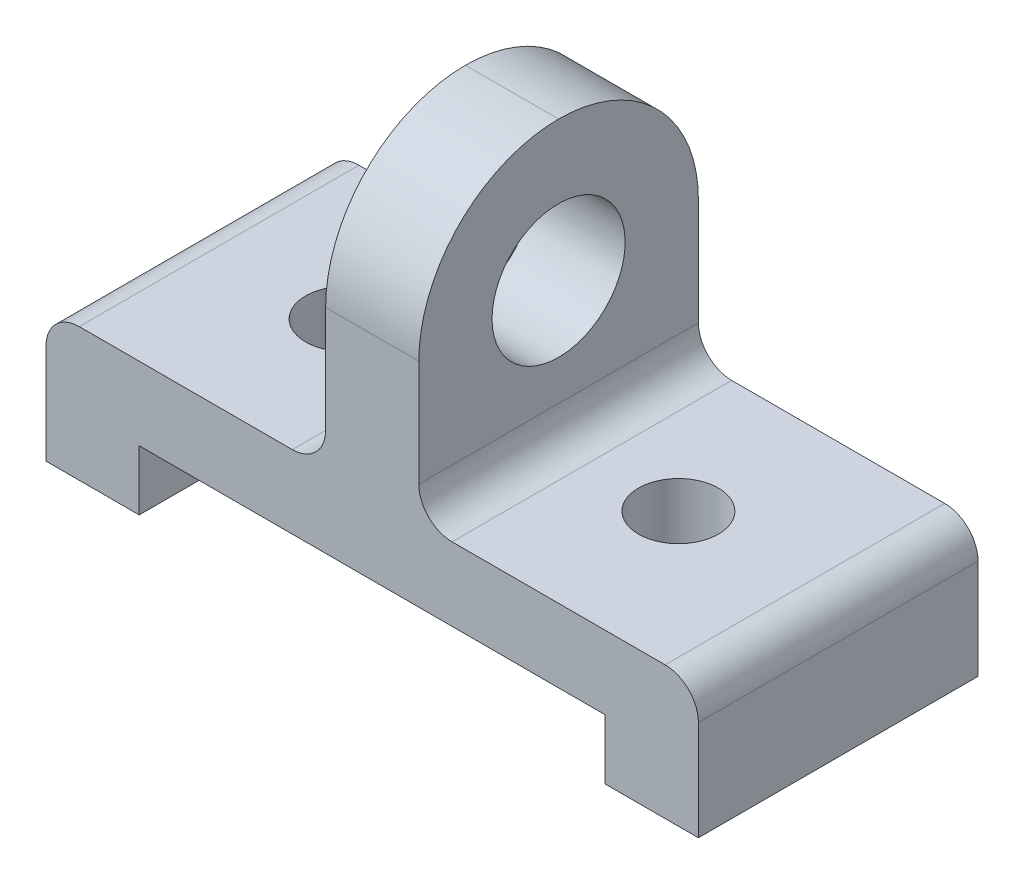
ISO-10303-21;
HEADER;
FILE_DESCRIPTION(('STEP AP214'),'2;1');
FILE_NAME('part.step','',(''),(''),'','','');
FILE_SCHEMA(('AUTOMOTIVE_DESIGN { 1 0 10303 214 1 1 1 1 }'));
ENDSEC;
DATA;
#1=APPLICATION_CONTEXT('core data for automotive mechanical design processes');
#2=APPLICATION_PROTOCOL_DEFINITION('international standard','automotive_design',2000,#1);
#3=PRODUCT_CONTEXT('',#1,'mechanical');
#4=PRODUCT('Part','Part','',(#3));
#5=PRODUCT_RELATED_PRODUCT_CATEGORY('part','',(#4));
#6=PRODUCT_DEFINITION_FORMATION('','',#4);
#7=PRODUCT_DEFINITION_CONTEXT('part definition',#1,'design');
#8=PRODUCT_DEFINITION('design','',#6,#7);
#9=PRODUCT_DEFINITION_SHAPE('','',#8);
#10=(LENGTH_UNIT() NAMED_UNIT(*) SI_UNIT(.MILLI.,.METRE.));
#11=(NAMED_UNIT(*) PLANE_ANGLE_UNIT() SI_UNIT($,.RADIAN.));
#12=(NAMED_UNIT(*) SI_UNIT($,.STERADIAN.) SOLID_ANGLE_UNIT());
#13=UNCERTAINTY_MEASURE_WITH_UNIT(LENGTH_MEASURE(1.E-05),#10,'distance_accuracy_value','');
#14=(GEOMETRIC_REPRESENTATION_CONTEXT(3) GLOBAL_UNCERTAINTY_ASSIGNED_CONTEXT((#13)) GLOBAL_UNIT_ASSIGNED_CONTEXT((#10,
#11,#12)) REPRESENTATION_CONTEXT('',''));
#15=CARTESIAN_POINT('',(0.,0.,0.));
#16=DIRECTION('',(0.,0.,1.));
#17=DIRECTION('',(1.,0.,0.));
#18=AXIS2_PLACEMENT_3D('',#15,#16,#17);
#19=CARTESIAN_POINT('',(0.,11.,0.));
#20=DIRECTION('',(0.,1.,0.));
#21=DIRECTION('',(0.,0.,1.));
#22=AXIS2_PLACEMENT_3D('',#19,#20,#21);
#23=PLANE('',#22);
#24=CARTESIAN_POINT('',(25.,11.,0.));
#25=DIRECTION('',(0.,1.,0.));
#26=DIRECTION('',(0.,0.,1.));
#27=AXIS2_PLACEMENT_3D('',#24,#25,#26);
#28=CIRCLE('',#27,6.);
#29=CARTESIAN_POINT('',(25.,11.,6.));
#30=VERTEX_POINT('',#29);
#31=EDGE_CURVE('E194',#30,#30,#28,.T.);
#32=ORIENTED_EDGE('',*,*,#31,.F.);
#33=EDGE_LOOP('',(#32));
#34=FACE_BOUND('',#33,.T.);
#35=DIRECTION('',(-1.,0.,0.));
#36=VECTOR('',#35,1.);
#37=CARTESIAN_POINT('',(-49.,11.,-21.));
#38=LINE('',#37,#36);
#39=CARTESIAN_POINT('',(44.,11.,-21.));
#40=VERTEX_POINT('',#39);
#41=CARTESIAN_POINT('',(12.,11.,-21.));
#42=VERTEX_POINT('',#41);
#43=EDGE_CURVE('E237',#40,#42,#38,.T.);
#44=ORIENTED_EDGE('',*,*,#43,.T.);
#45=DIRECTION('',(0.,0.,1.));
#46=VECTOR('',#45,1.);
#47=CARTESIAN_POINT('',(12.,11.,0.));
#48=LINE('',#47,#46);
#49=CARTESIAN_POINT('',(12.,11.,21.));
#50=VERTEX_POINT('',#49);
#51=EDGE_CURVE('E326',#42,#50,#48,.T.);
#52=ORIENTED_EDGE('',*,*,#51,.T.);
#53=DIRECTION('',(1.,0.,0.));
#54=VECTOR('',#53,1.);
#55=CARTESIAN_POINT('',(-49.,11.,21.));
#56=LINE('',#55,#54);
#57=CARTESIAN_POINT('',(44.,11.,21.));
#58=VERTEX_POINT('',#57);
#59=EDGE_CURVE('E241',#50,#58,#56,.T.);
#60=ORIENTED_EDGE('',*,*,#59,.T.);
#61=DIRECTION('',(0.,0.,-1.));
#62=VECTOR('',#61,1.);
#63=CARTESIAN_POINT('',(44.,11.,-21.));
#64=LINE('',#63,#62);
#65=EDGE_CURVE('E263',#58,#40,#64,.T.);
#66=ORIENTED_EDGE('',*,*,#65,.T.);
#67=EDGE_LOOP('',(#44,#52,#60,#66));
#68=FACE_BOUND('',#67,.T.);
#69=ADVANCED_FACE('F39',(#34,#68),#23,.T.);
#70=CARTESIAN_POINT('',(-25.,11.,0.));
#71=DIRECTION('',(0.,1.,0.));
#72=DIRECTION('',(0.,0.,1.));
#73=AXIS2_PLACEMENT_3D('',#70,#71,#72);
#74=CIRCLE('',#73,6.);
#75=CARTESIAN_POINT('',(-25.,11.,6.));
#76=VERTEX_POINT('',#75);
#77=EDGE_CURVE('E291',#76,#76,#74,.T.);
#78=ORIENTED_EDGE('',*,*,#77,.F.);
#79=EDGE_LOOP('',(#78));
#80=FACE_BOUND('',#79,.T.);
#81=CARTESIAN_POINT('',(-44.,11.,21.));
#82=VERTEX_POINT('',#81);
#83=CARTESIAN_POINT('',(-12.,11.,21.));
#84=VERTEX_POINT('',#83);
#85=EDGE_CURVE('E243',#82,#84,#56,.T.);
#86=ORIENTED_EDGE('',*,*,#85,.T.);
#87=DIRECTION('',(0.,0.,-1.));
#88=VECTOR('',#87,1.);
#89=CARTESIAN_POINT('',(-12.,11.,0.));
#90=LINE('',#89,#88);
#91=CARTESIAN_POINT('',(-12.,11.,-21.));
#92=VERTEX_POINT('',#91);
#93=EDGE_CURVE('E313',#84,#92,#90,.T.);
#94=ORIENTED_EDGE('',*,*,#93,.T.);
#95=CARTESIAN_POINT('',(-44.,11.,-21.));
#96=VERTEX_POINT('',#95);
#97=EDGE_CURVE('E242',#92,#96,#38,.T.);
#98=ORIENTED_EDGE('',*,*,#97,.T.);
#99=DIRECTION('',(0.,0.,1.));
#100=VECTOR('',#99,1.);
#101=CARTESIAN_POINT('',(-44.,11.,21.));
#102=LINE('',#101,#100);
#103=EDGE_CURVE('E259',#96,#82,#102,.T.);
#104=ORIENTED_EDGE('',*,*,#103,.T.);
#105=EDGE_LOOP('',(#86,#94,#98,#104));
#106=FACE_BOUND('',#105,.T.);
#107=ADVANCED_FACE('F343',(#80,#106),#23,.T.);
#108=CARTESIAN_POINT('',(49.,11.,-21.));
#109=DIRECTION('',(-1.,0.,0.));
#110=DIRECTION('',(0.,0.,1.));
#111=AXIS2_PLACEMENT_3D('',#108,#109,#110);
#112=PLANE('',#111);
#113=DIRECTION('',(0.,-1.,0.));
#114=VECTOR('',#113,1.);
#115=CARTESIAN_POINT('',(49.,11.,-21.));
#116=LINE('',#115,#114);
#117=CARTESIAN_POINT('',(49.,6.,-21.));
#118=VERTEX_POINT('',#117);
#119=CARTESIAN_POINT('',(49.,-9.,-21.));
#120=VERTEX_POINT('',#119);
#121=EDGE_CURVE('E256',#118,#120,#116,.T.);
#122=ORIENTED_EDGE('',*,*,#121,.F.);
#123=DIRECTION('',(0.,0.,-1.));
#124=VECTOR('',#123,1.);
#125=CARTESIAN_POINT('',(49.,6.,21.));
#126=LINE('',#125,#124);
#127=CARTESIAN_POINT('',(49.,6.,21.));
#128=VERTEX_POINT('',#127);
#129=EDGE_CURVE('E274',#118,#128,#126,.F.);
#130=ORIENTED_EDGE('',*,*,#129,.T.);
#131=DIRECTION('',(0.,-1.,0.));
#132=VECTOR('',#131,1.);
#133=CARTESIAN_POINT('',(49.,11.,21.));
#134=LINE('',#133,#132);
#135=CARTESIAN_POINT('',(49.,-9.,21.));
#136=VERTEX_POINT('',#135);
#137=EDGE_CURVE('E171',#128,#136,#134,.T.);
#138=ORIENTED_EDGE('',*,*,#137,.T.);
#139=DIRECTION('',(0.,0.,-1.));
#140=VECTOR('',#139,1.);
#141=CARTESIAN_POINT('',(49.,-9.,-21.));
#142=LINE('',#141,#140);
#143=EDGE_CURVE('E210',#136,#120,#142,.T.);
#144=ORIENTED_EDGE('',*,*,#143,.T.);
#145=EDGE_LOOP('',(#122,#130,#138,#144));
#146=FACE_BOUND('',#145,.T.);
#147=ADVANCED_FACE('F372',(#146),#112,.F.);
#148=CARTESIAN_POINT('',(-49.,11.,-21.));
#149=DIRECTION('',(0.,0.,1.));
#150=DIRECTION('',(1.,0.,0.));
#151=AXIS2_PLACEMENT_3D('',#148,#149,#150);
#152=PLANE('',#151);
#153=DIRECTION('',(0.,-1.,0.));
#154=VECTOR('',#153,1.);
#155=CARTESIAN_POINT('',(-7.,53.,-21.));
#156=LINE('',#155,#154);
#157=CARTESIAN_POINT('',(-7.,32.,-21.));
#158=VERTEX_POINT('',#157);
#159=CARTESIAN_POINT('',(-7.,16.,-21.));
#160=VERTEX_POINT('',#159);
#161=EDGE_CURVE('E455',#158,#160,#156,.T.);
#162=ORIENTED_EDGE('',*,*,#161,.F.);
#163=DIRECTION('',(-1.,0.,0.));
#164=VECTOR('',#163,1.);
#165=CARTESIAN_POINT('',(7.,32.,-21.));
#166=LINE('',#165,#164);
#167=CARTESIAN_POINT('',(7.,32.,-21.));
#168=VERTEX_POINT('',#167);
#169=EDGE_CURVE('E300',#158,#168,#166,.F.);
#170=ORIENTED_EDGE('',*,*,#169,.T.);
#171=DIRECTION('',(0.,-1.,0.));
#172=VECTOR('',#171,1.);
#173=CARTESIAN_POINT('',(7.,53.,-21.));
#174=LINE('',#173,#172);
#175=CARTESIAN_POINT('',(7.,16.,-21.));
#176=VERTEX_POINT('',#175);
#177=EDGE_CURVE('E459',#168,#176,#174,.T.);
#178=ORIENTED_EDGE('',*,*,#177,.T.);
#179=CARTESIAN_POINT('',(12.,16.,-21.));
#180=DIRECTION('',(0.,0.,1.));
#181=DIRECTION('',(1.,0.,0.));
#182=AXIS2_PLACEMENT_3D('',#179,#180,#181);
#183=CIRCLE('',#182,5.);
#184=EDGE_CURVE('E11',#176,#42,#183,.T.);
#185=ORIENTED_EDGE('',*,*,#184,.T.);
#186=ORIENTED_EDGE('',*,*,#43,.F.);
#187=CARTESIAN_POINT('',(44.,6.,-21.));
#188=DIRECTION('',(0.,0.,1.));
#189=DIRECTION('',(1.,0.,0.));
#190=AXIS2_PLACEMENT_3D('',#187,#188,#189);
#191=CIRCLE('',#190,5.);
#192=EDGE_CURVE('E271',#40,#118,#191,.F.);
#193=ORIENTED_EDGE('',*,*,#192,.T.);
#194=ORIENTED_EDGE('',*,*,#121,.T.);
#195=DIRECTION('',(-1.,0.,0.));
#196=VECTOR('',#195,1.);
#197=CARTESIAN_POINT('',(49.,-9.,-21.));
#198=LINE('',#197,#196);
#199=CARTESIAN_POINT('',(35.,-9.,-21.));
#200=VERTEX_POINT('',#199);
#201=EDGE_CURVE('E214',#120,#200,#198,.T.);
#202=ORIENTED_EDGE('',*,*,#201,.T.);
#203=DIRECTION('',(0.,1.,0.));
#204=VECTOR('',#203,1.);
#205=CARTESIAN_POINT('',(35.,-9.,-21.));
#206=LINE('',#205,#204);
#207=CARTESIAN_POINT('',(35.,0.,-21.));
#208=VERTEX_POINT('',#207);
#209=EDGE_CURVE('E226',#200,#208,#206,.T.);
#210=ORIENTED_EDGE('',*,*,#209,.T.);
#211=DIRECTION('',(-1.,0.,0.));
#212=VECTOR('',#211,1.);
#213=CARTESIAN_POINT('',(-49.,0.,-21.));
#214=LINE('',#213,#212);
#215=CARTESIAN_POINT('',(-35.,0.,-21.));
#216=VERTEX_POINT('',#215);
#217=EDGE_CURVE('E234',#208,#216,#214,.T.);
#218=ORIENTED_EDGE('',*,*,#217,.T.);
#219=DIRECTION('',(0.,1.,0.));
#220=VECTOR('',#219,1.);
#221=CARTESIAN_POINT('',(-35.,-9.,-21.));
#222=LINE('',#221,#220);
#223=CARTESIAN_POINT('',(-35.,-9.,-21.));
#224=VERTEX_POINT('',#223);
#225=EDGE_CURVE('E203',#224,#216,#222,.T.);
#226=ORIENTED_EDGE('',*,*,#225,.F.);
#227=DIRECTION('',(-1.,0.,0.));
#228=VECTOR('',#227,1.);
#229=CARTESIAN_POINT('',(-49.,-9.,-21.));
#230=LINE('',#229,#228);
#231=CARTESIAN_POINT('',(-49.,-9.,-21.));
#232=VERTEX_POINT('',#231);
#233=EDGE_CURVE('E199',#224,#232,#230,.T.);
#234=ORIENTED_EDGE('',*,*,#233,.T.);
#235=DIRECTION('',(0.,-1.,0.));
#236=VECTOR('',#235,1.);
#237=CARTESIAN_POINT('',(-49.,11.,-21.));
#238=LINE('',#237,#236);
#239=CARTESIAN_POINT('',(-49.,6.,-21.));
#240=VERTEX_POINT('',#239);
#241=EDGE_CURVE('E170',#240,#232,#238,.T.);
#242=ORIENTED_EDGE('',*,*,#241,.F.);
#243=CARTESIAN_POINT('',(-44.,6.,-21.));
#244=DIRECTION('',(0.,0.,1.));
#245=DIRECTION('',(1.,0.,0.));
#246=AXIS2_PLACEMENT_3D('',#243,#244,#245);
#247=CIRCLE('',#246,5.);
#248=EDGE_CURVE('E267',#240,#96,#247,.F.);
#249=ORIENTED_EDGE('',*,*,#248,.T.);
#250=ORIENTED_EDGE('',*,*,#97,.F.);
#251=CARTESIAN_POINT('',(-12.,16.,-21.));
#252=DIRECTION('',(0.,0.,1.));
#253=DIRECTION('',(1.,0.,0.));
#254=AXIS2_PLACEMENT_3D('',#251,#252,#253);
#255=CIRCLE('',#254,5.);
#256=EDGE_CURVE('E332',#92,#160,#255,.T.);
#257=ORIENTED_EDGE('',*,*,#256,.T.);
#258=EDGE_LOOP('',(#162,#170,#178,#185,#186,#193,#194,#202,#210,#218,#226,#234,#242,#249,#250,#257));
#259=FACE_BOUND('',#258,.T.);
#260=ADVANCED_FACE('F349',(#259),#152,.F.);
#261=CARTESIAN_POINT('',(-49.,11.,-21.));
#262=DIRECTION('',(1.,0.,0.));
#263=DIRECTION('',(0.,0.,-1.));
#264=AXIS2_PLACEMENT_3D('',#261,#262,#263);
#265=PLANE('',#264);
#266=DIRECTION('',(0.,-1.,0.));
#267=VECTOR('',#266,1.);
#268=CARTESIAN_POINT('',(-49.,11.,21.));
#269=LINE('',#268,#267);
#270=CARTESIAN_POINT('',(-49.,6.,21.));
#271=VERTEX_POINT('',#270);
#272=CARTESIAN_POINT('',(-49.,-9.,21.));
#273=VERTEX_POINT('',#272);
#274=EDGE_CURVE('E159',#271,#273,#269,.T.);
#275=ORIENTED_EDGE('',*,*,#274,.F.);
#276=DIRECTION('',(0.,0.,1.));
#277=VECTOR('',#276,1.);
#278=CARTESIAN_POINT('',(-49.,6.,-21.));
#279=LINE('',#278,#277);
#280=EDGE_CURVE('E283',#271,#240,#279,.F.);
#281=ORIENTED_EDGE('',*,*,#280,.T.);
#282=ORIENTED_EDGE('',*,*,#241,.T.);
#283=DIRECTION('',(0.,0.,1.));
#284=VECTOR('',#283,1.);
#285=CARTESIAN_POINT('',(-49.,-9.,21.));
#286=LINE('',#285,#284);
#287=EDGE_CURVE('E178',#232,#273,#286,.T.);
#288=ORIENTED_EDGE('',*,*,#287,.T.);
#289=EDGE_LOOP('',(#275,#281,#282,#288));
#290=FACE_BOUND('',#289,.T.);
#291=ADVANCED_FACE('F184',(#290),#265,.F.);
#292=CARTESIAN_POINT('',(-49.,11.,21.));
#293=DIRECTION('',(0.,0.,-1.));
#294=DIRECTION('',(-1.,0.,0.));
#295=AXIS2_PLACEMENT_3D('',#292,#293,#294);
#296=PLANE('',#295);
#297=DIRECTION('',(0.,-1.,0.));
#298=VECTOR('',#297,1.);
#299=CARTESIAN_POINT('',(7.,53.,21.));
#300=LINE('',#299,#298);
#301=CARTESIAN_POINT('',(7.,32.,21.));
#302=VERTEX_POINT('',#301);
#303=CARTESIAN_POINT('',(7.,16.,21.));
#304=VERTEX_POINT('',#303);
#305=EDGE_CURVE('E318',#302,#304,#300,.T.);
#306=ORIENTED_EDGE('',*,*,#305,.F.);
#307=DIRECTION('',(1.,0.,0.));
#308=VECTOR('',#307,1.);
#309=CARTESIAN_POINT('',(-7.,32.,21.));
#310=LINE('',#309,#308);
#311=CARTESIAN_POINT('',(-7.,32.,21.));
#312=VERTEX_POINT('',#311);
#313=EDGE_CURVE('E310',#302,#312,#310,.F.);
#314=ORIENTED_EDGE('',*,*,#313,.T.);
#315=DIRECTION('',(0.,-1.,0.));
#316=VECTOR('',#315,1.);
#317=CARTESIAN_POINT('',(-7.,53.,21.));
#318=LINE('',#317,#316);
#319=CARTESIAN_POINT('',(-7.,16.,21.));
#320=VERTEX_POINT('',#319);
#321=EDGE_CURVE('E451',#312,#320,#318,.T.);
#322=ORIENTED_EDGE('',*,*,#321,.T.);
#323=CARTESIAN_POINT('',(-12.,16.,21.));
#324=DIRECTION('',(0.,0.,-1.));
#325=DIRECTION('',(-1.,0.,0.));
#326=AXIS2_PLACEMENT_3D('',#323,#324,#325);
#327=CIRCLE('',#326,5.);
#328=EDGE_CURVE('E335',#320,#84,#327,.T.);
#329=ORIENTED_EDGE('',*,*,#328,.T.);
#330=ORIENTED_EDGE('',*,*,#85,.F.);
#331=CARTESIAN_POINT('',(-44.,6.,21.));
#332=DIRECTION('',(0.,0.,-1.));
#333=DIRECTION('',(-1.,0.,0.));
#334=AXIS2_PLACEMENT_3D('',#331,#332,#333);
#335=CIRCLE('',#334,5.);
#336=EDGE_CURVE('E165',#82,#271,#335,.F.);
#337=ORIENTED_EDGE('',*,*,#336,.T.);
#338=ORIENTED_EDGE('',*,*,#274,.T.);
#339=DIRECTION('',(1.,0.,0.));
#340=VECTOR('',#339,1.);
#341=CARTESIAN_POINT('',(-49.,-9.,21.));
#342=LINE('',#341,#340);
#343=CARTESIAN_POINT('',(-35.,-9.,21.));
#344=VERTEX_POINT('',#343);
#345=EDGE_CURVE('E163',#273,#344,#342,.T.);
#346=ORIENTED_EDGE('',*,*,#345,.T.);
#347=DIRECTION('',(0.,1.,0.));
#348=VECTOR('',#347,1.);
#349=CARTESIAN_POINT('',(-35.,-9.,21.));
#350=LINE('',#349,#348);
#351=CARTESIAN_POINT('',(-35.,0.,21.));
#352=VERTEX_POINT('',#351);
#353=EDGE_CURVE('E201',#344,#352,#350,.T.);
#354=ORIENTED_EDGE('',*,*,#353,.T.);
#355=DIRECTION('',(1.,0.,0.));
#356=VECTOR('',#355,1.);
#357=CARTESIAN_POINT('',(-49.,0.,21.));
#358=LINE('',#357,#356);
#359=CARTESIAN_POINT('',(35.,0.,21.));
#360=VERTEX_POINT('',#359);
#361=EDGE_CURVE('E249',#352,#360,#358,.T.);
#362=ORIENTED_EDGE('',*,*,#361,.T.);
#363=DIRECTION('',(0.,1.,0.));
#364=VECTOR('',#363,1.);
#365=CARTESIAN_POINT('',(35.,-9.,21.));
#366=LINE('',#365,#364);
#367=CARTESIAN_POINT('',(35.,-9.,21.));
#368=VERTEX_POINT('',#367);
#369=EDGE_CURVE('E230',#368,#360,#366,.T.);
#370=ORIENTED_EDGE('',*,*,#369,.F.);
#371=DIRECTION('',(1.,0.,0.));
#372=VECTOR('',#371,1.);
#373=CARTESIAN_POINT('',(49.,-9.,21.));
#374=LINE('',#373,#372);
#375=EDGE_CURVE('E222',#368,#136,#374,.T.);
#376=ORIENTED_EDGE('',*,*,#375,.T.);
#377=ORIENTED_EDGE('',*,*,#137,.F.);
#378=CARTESIAN_POINT('',(44.,6.,21.));
#379=DIRECTION('',(0.,0.,-1.));
#380=DIRECTION('',(-1.,0.,0.));
#381=AXIS2_PLACEMENT_3D('',#378,#379,#380);
#382=CIRCLE('',#381,5.);
#383=EDGE_CURVE('E279',#128,#58,#382,.F.);
#384=ORIENTED_EDGE('',*,*,#383,.T.);
#385=ORIENTED_EDGE('',*,*,#59,.F.);
#386=CARTESIAN_POINT('',(12.,16.,21.));
#387=DIRECTION('',(0.,0.,-1.));
#388=DIRECTION('',(-1.,0.,0.));
#389=AXIS2_PLACEMENT_3D('',#386,#387,#388);
#390=CIRCLE('',#389,5.);
#391=EDGE_CURVE('E49',#50,#304,#390,.T.);
#392=ORIENTED_EDGE('',*,*,#391,.T.);
#393=EDGE_LOOP('',(#306,#314,#322,#329,#330,#337,#338,#346,#354,#362,#370,#376,#377,#384,#385,#392));
#394=FACE_BOUND('',#393,.T.);
#395=ADVANCED_FACE('F161',(#394),#296,.F.);
#396=CARTESIAN_POINT('',(0.,0.,0.));
#397=DIRECTION('',(0.,1.,0.));
#398=DIRECTION('',(0.,0.,1.));
#399=AXIS2_PLACEMENT_3D('',#396,#397,#398);
#400=PLANE('',#399);
#401=DIRECTION('',(0.,0.,-1.));
#402=VECTOR('',#401,1.);
#403=CARTESIAN_POINT('',(-35.,0.,21.));
#404=LINE('',#403,#402);
#405=EDGE_CURVE('E187',#352,#216,#404,.T.);
#406=ORIENTED_EDGE('',*,*,#405,.T.);
#407=ORIENTED_EDGE('',*,*,#217,.F.);
#408=DIRECTION('',(0.,0.,1.));
#409=VECTOR('',#408,1.);
#410=CARTESIAN_POINT('',(35.,0.,-21.));
#411=LINE('',#410,#409);
#412=EDGE_CURVE('E207',#208,#360,#411,.T.);
#413=ORIENTED_EDGE('',*,*,#412,.T.);
#414=ORIENTED_EDGE('',*,*,#361,.F.);
#415=EDGE_LOOP('',(#406,#407,#413,#414));
#416=FACE_BOUND('',#415,.T.);
#417=CARTESIAN_POINT('',(-25.,0.,0.));
#418=DIRECTION('',(0.,1.,0.));
#419=DIRECTION('',(0.,0.,1.));
#420=AXIS2_PLACEMENT_3D('',#417,#418,#419);
#421=CIRCLE('',#420,6.);
#422=CARTESIAN_POINT('',(-25.,0.,6.));
#423=VERTEX_POINT('',#422);
#424=EDGE_CURVE('E191',#423,#423,#421,.T.);
#425=ORIENTED_EDGE('',*,*,#424,.T.);
#426=EDGE_LOOP('',(#425));
#427=FACE_BOUND('',#426,.T.);
#428=CARTESIAN_POINT('',(25.,0.,0.));
#429=DIRECTION('',(0.,1.,0.));
#430=DIRECTION('',(0.,0.,1.));
#431=AXIS2_PLACEMENT_3D('',#428,#429,#430);
#432=CIRCLE('',#431,6.);
#433=CARTESIAN_POINT('',(25.,0.,6.));
#434=VERTEX_POINT('',#433);
#435=EDGE_CURVE('E287',#434,#434,#432,.T.);
#436=ORIENTED_EDGE('',*,*,#435,.T.);
#437=EDGE_LOOP('',(#436));
#438=FACE_BOUND('',#437,.T.);
#439=ADVANCED_FACE('F380',(#416,#427,#438),#400,.F.);
#440=CARTESIAN_POINT('',(35.,-9.,-21.));
#441=DIRECTION('',(-1.,0.,0.));
#442=DIRECTION('',(0.,0.,1.));
#443=AXIS2_PLACEMENT_3D('',#440,#441,#442);
#444=PLANE('',#443);
#445=ORIENTED_EDGE('',*,*,#412,.F.);
#446=ORIENTED_EDGE('',*,*,#209,.F.);
#447=DIRECTION('',(0.,0.,1.));
#448=VECTOR('',#447,1.);
#449=CARTESIAN_POINT('',(35.,-9.,-21.));
#450=LINE('',#449,#448);
#451=EDGE_CURVE('E218',#200,#368,#450,.T.);
#452=ORIENTED_EDGE('',*,*,#451,.T.);
#453=ORIENTED_EDGE('',*,*,#369,.T.);
#454=EDGE_LOOP('',(#445,#446,#452,#453));
#455=FACE_BOUND('',#454,.T.);
#456=ADVANCED_FACE('F378',(#455),#444,.T.);
#457=CARTESIAN_POINT('',(0.,-9.,0.));
#458=DIRECTION('',(0.,-1.,0.));
#459=DIRECTION('',(0.,0.,-1.));
#460=AXIS2_PLACEMENT_3D('',#457,#458,#459);
#461=PLANE('',#460);
#462=ORIENTED_EDGE('',*,*,#143,.F.);
#463=ORIENTED_EDGE('',*,*,#375,.F.);
#464=ORIENTED_EDGE('',*,*,#451,.F.);
#465=ORIENTED_EDGE('',*,*,#201,.F.);
#466=EDGE_LOOP('',(#462,#463,#464,#465));
#467=FACE_BOUND('',#466,.T.);
#468=ADVANCED_FACE('F403',(#467),#461,.T.);
#469=CARTESIAN_POINT('',(-35.,-9.,21.));
#470=DIRECTION('',(1.,0.,0.));
#471=DIRECTION('',(0.,0.,-1.));
#472=AXIS2_PLACEMENT_3D('',#469,#470,#471);
#473=PLANE('',#472);
#474=ORIENTED_EDGE('',*,*,#405,.F.);
#475=ORIENTED_EDGE('',*,*,#353,.F.);
#476=DIRECTION('',(0.,0.,-1.));
#477=VECTOR('',#476,1.);
#478=CARTESIAN_POINT('',(-35.,-9.,21.));
#479=LINE('',#478,#477);
#480=EDGE_CURVE('E181',#344,#224,#479,.T.);
#481=ORIENTED_EDGE('',*,*,#480,.T.);
#482=ORIENTED_EDGE('',*,*,#225,.T.);
#483=EDGE_LOOP('',(#474,#475,#481,#482));
#484=FACE_BOUND('',#483,.T.);
#485=ADVANCED_FACE('F411',(#484),#473,.T.);
#486=CARTESIAN_POINT('',(0.,-9.,0.));
#487=DIRECTION('',(0.,-1.,0.));
#488=DIRECTION('',(0.,0.,-1.));
#489=AXIS2_PLACEMENT_3D('',#486,#487,#488);
#490=PLANE('',#489);
#491=ORIENTED_EDGE('',*,*,#287,.F.);
#492=ORIENTED_EDGE('',*,*,#233,.F.);
#493=ORIENTED_EDGE('',*,*,#480,.F.);
#494=ORIENTED_EDGE('',*,*,#345,.F.);
#495=EDGE_LOOP('',(#491,#492,#493,#494));
#496=FACE_BOUND('',#495,.T.);
#497=ADVANCED_FACE('F176',(#496),#490,.T.);
#498=CARTESIAN_POINT('',(44.,6.,0.));
#499=DIRECTION('',(0.,0.,1.));
#500=DIRECTION('',(1.,0.,0.));
#501=AXIS2_PLACEMENT_3D('',#498,#499,#500);
#502=CYLINDRICAL_SURFACE('',#501,5.);
#503=ORIENTED_EDGE('',*,*,#383,.F.);
#504=ORIENTED_EDGE('',*,*,#129,.F.);
#505=ORIENTED_EDGE('',*,*,#192,.F.);
#506=ORIENTED_EDGE('',*,*,#65,.F.);
#507=EDGE_LOOP('',(#503,#504,#505,#506));
#508=FACE_BOUND('',#507,.T.);
#509=ADVANCED_FACE('F354',(#508),#502,.T.);
#510=CARTESIAN_POINT('',(-44.,6.,0.));
#511=DIRECTION('',(0.,0.,-1.));
#512=DIRECTION('',(-1.,0.,0.));
#513=AXIS2_PLACEMENT_3D('',#510,#511,#512);
#514=CYLINDRICAL_SURFACE('',#513,5.);
#515=ORIENTED_EDGE('',*,*,#248,.F.);
#516=ORIENTED_EDGE('',*,*,#280,.F.);
#517=ORIENTED_EDGE('',*,*,#336,.F.);
#518=ORIENTED_EDGE('',*,*,#103,.F.);
#519=EDGE_LOOP('',(#515,#516,#517,#518));
#520=FACE_BOUND('',#519,.T.);
#521=ADVANCED_FACE('F351',(#520),#514,.T.);
#522=CARTESIAN_POINT('',(25.,-9.,0.));
#523=DIRECTION('',(0.,1.,0.));
#524=DIRECTION('',(0.,0.,1.));
#525=AXIS2_PLACEMENT_3D('',#522,#523,#524);
#526=CYLINDRICAL_SURFACE('',#525,6.);
#527=ORIENTED_EDGE('',*,*,#31,.T.);
#528=EDGE_LOOP('',(#527));
#529=FACE_BOUND('',#528,.T.);
#530=ORIENTED_EDGE('',*,*,#435,.F.);
#531=EDGE_LOOP('',(#530));
#532=FACE_BOUND('',#531,.T.);
#533=ADVANCED_FACE('F353',(#529,#532),#526,.F.);
#534=CARTESIAN_POINT('',(-25.,-9.,0.));
#535=DIRECTION('',(0.,1.,0.));
#536=DIRECTION('',(0.,0.,1.));
#537=AXIS2_PLACEMENT_3D('',#534,#535,#536);
#538=CYLINDRICAL_SURFACE('',#537,6.);
#539=ORIENTED_EDGE('',*,*,#77,.T.);
#540=EDGE_LOOP('',(#539));
#541=FACE_BOUND('',#540,.T.);
#542=ORIENTED_EDGE('',*,*,#424,.F.);
#543=EDGE_LOOP('',(#542));
#544=FACE_BOUND('',#543,.T.);
#545=ADVANCED_FACE('F360',(#541,#544),#538,.F.);
#546=CARTESIAN_POINT('',(7.,53.,-21.));
#547=DIRECTION('',(-1.,0.,0.));
#548=DIRECTION('',(0.,0.,1.));
#549=AXIS2_PLACEMENT_3D('',#546,#547,#548);
#550=PLANE('',#549);
#551=CARTESIAN_POINT('',(7.,32.,0.));
#552=DIRECTION('',(-1.,0.,0.));
#553=DIRECTION('',(0.,0.,1.));
#554=AXIS2_PLACEMENT_3D('',#551,#552,#553);
#555=CIRCLE('',#554,10.);
#556=CARTESIAN_POINT('',(7.,32.,10.));
#557=VERTEX_POINT('',#556);
#558=EDGE_CURVE('E319',#557,#557,#555,.F.);
#559=ORIENTED_EDGE('',*,*,#558,.F.);
#560=EDGE_LOOP('',(#559));
#561=FACE_BOUND('',#560,.T.);
#562=ORIENTED_EDGE('',*,*,#305,.T.);
#563=DIRECTION('',(0.,0.,1.));
#564=VECTOR('',#563,1.);
#565=CARTESIAN_POINT('',(7.,16.,-21.));
#566=LINE('',#565,#564);
#567=EDGE_CURVE('E62',#304,#176,#566,.F.);
#568=ORIENTED_EDGE('',*,*,#567,.T.);
#569=ORIENTED_EDGE('',*,*,#177,.F.);
#570=CARTESIAN_POINT('',(7.,32.,0.));
#571=DIRECTION('',(-1.,0.,0.));
#572=DIRECTION('',(0.,0.,1.));
#573=AXIS2_PLACEMENT_3D('',#570,#571,#572);
#574=CIRCLE('',#573,21.);
#575=CARTESIAN_POINT('',(7.,53.,0.));
#576=VERTEX_POINT('',#575);
#577=EDGE_CURVE('E307',#168,#576,#574,.F.);
#578=ORIENTED_EDGE('',*,*,#577,.T.);
#579=CARTESIAN_POINT('',(7.,32.,0.));
#580=DIRECTION('',(-1.,0.,0.));
#581=DIRECTION('',(0.,0.,1.));
#582=AXIS2_PLACEMENT_3D('',#579,#580,#581);
#583=CIRCLE('',#582,21.);
#584=EDGE_CURVE('E304',#576,#302,#583,.F.);
#585=ORIENTED_EDGE('',*,*,#584,.T.);
#586=EDGE_LOOP('',(#562,#568,#569,#578,#585));
#587=FACE_BOUND('',#586,.T.);
#588=ADVANCED_FACE('F422',(#561,#587),#550,.F.);
#589=CARTESIAN_POINT('',(-7.,53.,-21.));
#590=DIRECTION('',(1.,0.,0.));
#591=DIRECTION('',(0.,0.,-1.));
#592=AXIS2_PLACEMENT_3D('',#589,#590,#591);
#593=PLANE('',#592);
#594=CARTESIAN_POINT('',(-7.,32.,0.));
#595=DIRECTION('',(1.,0.,0.));
#596=DIRECTION('',(0.,0.,-1.));
#597=AXIS2_PLACEMENT_3D('',#594,#595,#596);
#598=CIRCLE('',#597,10.);
#599=CARTESIAN_POINT('',(-7.,32.,-10.));
#600=VERTEX_POINT('',#599);
#601=EDGE_CURVE('E43',#600,#600,#598,.F.);
#602=ORIENTED_EDGE('',*,*,#601,.F.);
#603=EDGE_LOOP('',(#602));
#604=FACE_BOUND('',#603,.T.);
#605=ORIENTED_EDGE('',*,*,#161,.T.);
#606=DIRECTION('',(0.,0.,-1.));
#607=VECTOR('',#606,1.);
#608=CARTESIAN_POINT('',(-7.,16.,-21.));
#609=LINE('',#608,#607);
#610=EDGE_CURVE('E323',#160,#320,#609,.F.);
#611=ORIENTED_EDGE('',*,*,#610,.T.);
#612=ORIENTED_EDGE('',*,*,#321,.F.);
#613=CARTESIAN_POINT('',(-7.,32.,0.));
#614=DIRECTION('',(1.,0.,0.));
#615=DIRECTION('',(0.,0.,-1.));
#616=AXIS2_PLACEMENT_3D('',#613,#614,#615);
#617=CIRCLE('',#616,21.);
#618=CARTESIAN_POINT('',(-7.,53.,0.));
#619=VERTEX_POINT('',#618);
#620=EDGE_CURVE('E286',#312,#619,#617,.F.);
#621=ORIENTED_EDGE('',*,*,#620,.T.);
#622=CARTESIAN_POINT('',(-7.,32.,0.));
#623=DIRECTION('',(1.,0.,0.));
#624=DIRECTION('',(0.,0.,-1.));
#625=AXIS2_PLACEMENT_3D('',#622,#623,#624);
#626=CIRCLE('',#625,21.);
#627=EDGE_CURVE('E297',#619,#158,#626,.F.);
#628=ORIENTED_EDGE('',*,*,#627,.T.);
#629=EDGE_LOOP('',(#605,#611,#612,#621,#628));
#630=FACE_BOUND('',#629,.T.);
#631=ADVANCED_FACE('F426',(#604,#630),#593,.F.);
#632=CARTESIAN_POINT('',(0.,32.,0.));
#633=DIRECTION('',(-1.,0.,0.));
#634=DIRECTION('',(0.,0.,1.));
#635=AXIS2_PLACEMENT_3D('',#632,#633,#634);
#636=CYLINDRICAL_SURFACE('',#635,21.);
#637=ORIENTED_EDGE('',*,*,#313,.F.);
#638=ORIENTED_EDGE('',*,*,#584,.F.);
#639=DIRECTION('',(1.,0.,0.));
#640=VECTOR('',#639,1.);
#641=CARTESIAN_POINT('',(7.,53.,0.));
#642=LINE('',#641,#640);
#643=EDGE_CURVE('E314',#619,#576,#642,.T.);
#644=ORIENTED_EDGE('',*,*,#643,.F.);
#645=ORIENTED_EDGE('',*,*,#620,.F.);
#646=EDGE_LOOP('',(#637,#638,#644,#645));
#647=FACE_BOUND('',#646,.T.);
#648=ADVANCED_FACE('F430',(#647),#636,.T.);
#649=CARTESIAN_POINT('',(0.,32.,0.));
#650=DIRECTION('',(1.,0.,0.));
#651=DIRECTION('',(0.,0.,-1.));
#652=AXIS2_PLACEMENT_3D('',#649,#650,#651);
#653=CYLINDRICAL_SURFACE('',#652,21.);
#654=ORIENTED_EDGE('',*,*,#577,.F.);
#655=ORIENTED_EDGE('',*,*,#169,.F.);
#656=ORIENTED_EDGE('',*,*,#627,.F.);
#657=ORIENTED_EDGE('',*,*,#643,.T.);
#658=EDGE_LOOP('',(#654,#655,#656,#657));
#659=FACE_BOUND('',#658,.T.);
#660=ADVANCED_FACE('F482',(#659),#653,.T.);
#661=CARTESIAN_POINT('',(-12.,16.,0.));
#662=DIRECTION('',(0.,0.,-1.));
#663=DIRECTION('',(-1.,0.,0.));
#664=AXIS2_PLACEMENT_3D('',#661,#662,#663);
#665=CYLINDRICAL_SURFACE('',#664,5.);
#666=ORIENTED_EDGE('',*,*,#328,.F.);
#667=ORIENTED_EDGE('',*,*,#610,.F.);
#668=ORIENTED_EDGE('',*,*,#256,.F.);
#669=ORIENTED_EDGE('',*,*,#93,.F.);
#670=EDGE_LOOP('',(#666,#667,#668,#669));
#671=FACE_BOUND('',#670,.T.);
#672=ADVANCED_FACE('F438',(#671),#665,.F.);
#673=CARTESIAN_POINT('',(12.,16.,0.));
#674=DIRECTION('',(0.,0.,1.));
#675=DIRECTION('',(1.,0.,0.));
#676=AXIS2_PLACEMENT_3D('',#673,#674,#675);
#677=CYLINDRICAL_SURFACE('',#676,5.);
#678=ORIENTED_EDGE('',*,*,#184,.F.);
#679=ORIENTED_EDGE('',*,*,#567,.F.);
#680=ORIENTED_EDGE('',*,*,#391,.F.);
#681=ORIENTED_EDGE('',*,*,#51,.F.);
#682=EDGE_LOOP('',(#678,#679,#680,#681));
#683=FACE_BOUND('',#682,.T.);
#684=ADVANCED_FACE('F41',(#683),#677,.F.);
#685=CARTESIAN_POINT('',(49.,32.,0.));
#686=DIRECTION('',(-1.,0.,0.));
#687=DIRECTION('',(0.,0.,1.));
#688=AXIS2_PLACEMENT_3D('',#685,#686,#687);
#689=CYLINDRICAL_SURFACE('',#688,10.);
#690=ORIENTED_EDGE('',*,*,#601,.T.);
#691=EDGE_LOOP('',(#690));
#692=FACE_BOUND('',#691,.T.);
#693=ORIENTED_EDGE('',*,*,#558,.T.);
#694=EDGE_LOOP('',(#693));
#695=FACE_BOUND('',#694,.T.);
#696=ADVANCED_FACE('F432',(#692,#695),#689,.F.);
#697=CLOSED_SHELL('',(#69,#107,#147,#260,#291,#395,#439,#456,#468,#485,#497,#509,#521,#533,#545,
#588,#631,#648,#660,#672,#684,#696));
#698=MANIFOLD_SOLID_BREP('B2',#697);
#699=ADVANCED_BREP_SHAPE_REPRESENTATION('',(#18,#698),#14);
#700=SHAPE_DEFINITION_REPRESENTATION(#9,#699);
ENDSEC;
END-ISO-10303-21;
